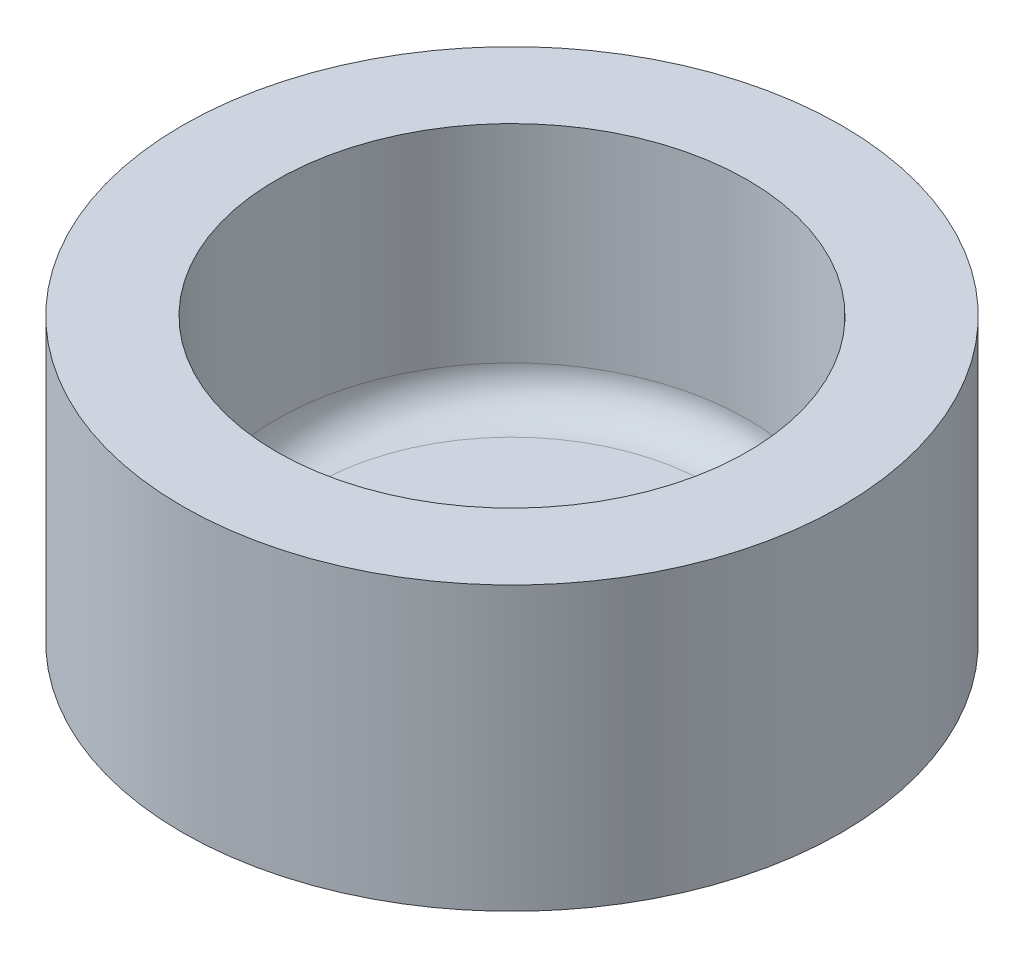
ISO-10303-21;
HEADER;
FILE_DESCRIPTION(('STEP AP214'),'2;1');
FILE_NAME('part.step','',(''),(''),'','','');
FILE_SCHEMA(('AUTOMOTIVE_DESIGN { 1 0 10303 214 1 1 1 1 }'));
ENDSEC;
DATA;
#1=APPLICATION_CONTEXT('core data for automotive mechanical design processes');
#2=APPLICATION_PROTOCOL_DEFINITION('international standard','automotive_design',2000,#1);
#3=PRODUCT_CONTEXT('',#1,'mechanical');
#4=PRODUCT('Part','Part','',(#3));
#5=PRODUCT_RELATED_PRODUCT_CATEGORY('part','',(#4));
#6=PRODUCT_DEFINITION_FORMATION('','',#4);
#7=PRODUCT_DEFINITION_CONTEXT('part definition',#1,'design');
#8=PRODUCT_DEFINITION('design','',#6,#7);
#9=PRODUCT_DEFINITION_SHAPE('','',#8);
#10=(LENGTH_UNIT() NAMED_UNIT(*) SI_UNIT(.MILLI.,.METRE.));
#11=(NAMED_UNIT(*) PLANE_ANGLE_UNIT() SI_UNIT($,.RADIAN.));
#12=(NAMED_UNIT(*) SI_UNIT($,.STERADIAN.) SOLID_ANGLE_UNIT());
#13=UNCERTAINTY_MEASURE_WITH_UNIT(LENGTH_MEASURE(1.E-05),#10,'distance_accuracy_value','');
#14=(GEOMETRIC_REPRESENTATION_CONTEXT(3) GLOBAL_UNCERTAINTY_ASSIGNED_CONTEXT((#13)) GLOBAL_UNIT_ASSIGNED_CONTEXT((#10,
#11,#12)) REPRESENTATION_CONTEXT('',''));
#15=CARTESIAN_POINT('',(0.,0.,0.));
#16=DIRECTION('',(0.,0.,1.));
#17=DIRECTION('',(1.,0.,0.));
#18=AXIS2_PLACEMENT_3D('',#15,#16,#17);
#19=CARTESIAN_POINT('',(0.,15.,0.));
#20=DIRECTION('',(0.,-1.,0.));
#21=DIRECTION('',(0.,0.,-1.));
#22=AXIS2_PLACEMENT_3D('',#19,#20,#21);
#23=CYLINDRICAL_SURFACE('',#22,12.5);
#24=CARTESIAN_POINT('',(0.,4.,0.));
#25=DIRECTION('',(0.,-1.,0.));
#26=DIRECTION('',(0.,0.,-1.));
#27=AXIS2_PLACEMENT_3D('',#24,#25,#26);
#28=CIRCLE('',#27,12.5);
#29=CARTESIAN_POINT('',(0.,4.,-12.5));
#30=VERTEX_POINT('',#29);
#31=EDGE_CURVE('E42',#30,#30,#28,.T.);
#32=ORIENTED_EDGE('',*,*,#31,.T.);
#33=EDGE_LOOP('',(#32));
#34=FACE_BOUND('',#33,.T.);
#35=CARTESIAN_POINT('',(0.,15.,0.));
#36=DIRECTION('',(0.,1.,0.));
#37=DIRECTION('',(0.,0.,1.));
#38=AXIS2_PLACEMENT_3D('',#35,#36,#37);
#39=CIRCLE('',#38,12.5);
#40=CARTESIAN_POINT('',(0.,15.,12.5));
#41=VERTEX_POINT('',#40);
#42=EDGE_CURVE('E54',#41,#41,#39,.T.);
#43=ORIENTED_EDGE('',*,*,#42,.T.);
#44=EDGE_LOOP('',(#43));
#45=FACE_BOUND('',#44,.T.);
#46=ADVANCED_FACE('F35',(#34,#45),#23,.F.);
#47=CARTESIAN_POINT('',(0.,15.,0.));
#48=DIRECTION('',(0.,1.,0.));
#49=DIRECTION('',(0.,0.,1.));
#50=AXIS2_PLACEMENT_3D('',#47,#48,#49);
#51=PLANE('',#50);
#52=CARTESIAN_POINT('',(0.,15.,0.));
#53=DIRECTION('',(0.,1.,0.));
#54=DIRECTION('',(0.,0.,1.));
#55=AXIS2_PLACEMENT_3D('',#52,#53,#54);
#56=CIRCLE('',#55,17.5);
#57=CARTESIAN_POINT('',(0.,15.,17.5));
#58=VERTEX_POINT('',#57);
#59=EDGE_CURVE('E46',#58,#58,#56,.T.);
#60=ORIENTED_EDGE('',*,*,#59,.T.);
#61=EDGE_LOOP('',(#60));
#62=FACE_BOUND('',#61,.T.);
#63=ORIENTED_EDGE('',*,*,#42,.F.);
#64=EDGE_LOOP('',(#63));
#65=FACE_BOUND('',#64,.T.);
#66=ADVANCED_FACE('F60',(#62,#65),#51,.T.);
#67=CARTESIAN_POINT('',(0.,0.,0.));
#68=DIRECTION('',(0.,1.,0.));
#69=DIRECTION('',(0.,0.,1.));
#70=AXIS2_PLACEMENT_3D('',#67,#68,#69);
#71=PLANE('',#70);
#72=CARTESIAN_POINT('',(0.,0.,0.));
#73=DIRECTION('',(0.,1.,0.));
#74=DIRECTION('',(0.,0.,1.));
#75=AXIS2_PLACEMENT_3D('',#72,#73,#74);
#76=CIRCLE('',#75,17.5);
#77=CARTESIAN_POINT('',(0.,0.,17.5));
#78=VERTEX_POINT('',#77);
#79=EDGE_CURVE('E50',#78,#78,#76,.T.);
#80=ORIENTED_EDGE('',*,*,#79,.F.);
#81=EDGE_LOOP('',(#80));
#82=FACE_BOUND('',#81,.T.);
#83=ADVANCED_FACE('F62',(#82),#71,.F.);
#84=CARTESIAN_POINT('',(0.,15.,0.));
#85=DIRECTION('',(0.,-1.,0.));
#86=DIRECTION('',(0.,0.,-1.));
#87=AXIS2_PLACEMENT_3D('',#84,#85,#86);
#88=CYLINDRICAL_SURFACE('',#87,17.5);
#89=ORIENTED_EDGE('',*,*,#59,.F.);
#90=EDGE_LOOP('',(#89));
#91=FACE_BOUND('',#90,.T.);
#92=ORIENTED_EDGE('',*,*,#79,.T.);
#93=EDGE_LOOP('',(#92));
#94=FACE_BOUND('',#93,.T.);
#95=ADVANCED_FACE('F69',(#91,#94),#88,.T.);
#96=CARTESIAN_POINT('',(0.,2.,0.));
#97=DIRECTION('',(0.,-1.,0.));
#98=DIRECTION('',(0.,0.,-1.));
#99=AXIS2_PLACEMENT_3D('',#96,#97,#98);
#100=PLANE('',#99);
#101=CARTESIAN_POINT('',(0.,2.,0.));
#102=DIRECTION('',(0.,-1.,0.));
#103=DIRECTION('',(0.,0.,-1.));
#104=AXIS2_PLACEMENT_3D('',#101,#102,#103);
#105=CIRCLE('',#104,10.5);
#106=CARTESIAN_POINT('',(0.,2.,-10.5));
#107=VERTEX_POINT('',#106);
#108=EDGE_CURVE('E10',#107,#107,#105,.F.);
#109=ORIENTED_EDGE('',*,*,#108,.T.);
#110=EDGE_LOOP('',(#109));
#111=FACE_BOUND('',#110,.T.);
#112=ADVANCED_FACE('F75',(#111),#100,.F.);
#113=CARTESIAN_POINT('',(0.,4.,0.));
#114=DIRECTION('',(0.,-1.,0.));
#115=DIRECTION('',(0.,0.,-1.));
#116=AXIS2_PLACEMENT_3D('',#113,#114,#115);
#117=TOROIDAL_SURFACE('',#116,10.5,2.);
#118=ORIENTED_EDGE('',*,*,#108,.F.);
#119=EDGE_LOOP('',(#118));
#120=FACE_BOUND('',#119,.T.);
#121=ORIENTED_EDGE('',*,*,#31,.F.);
#122=EDGE_LOOP('',(#121));
#123=FACE_BOUND('',#122,.T.);
#124=ADVANCED_FACE('F37',(#120,#123),#117,.F.);
#125=CLOSED_SHELL('',(#46,#66,#83,#95,#112,#124));
#126=MANIFOLD_SOLID_BREP('B2',#125);
#127=ADVANCED_BREP_SHAPE_REPRESENTATION('',(#18,#126),#14);
#128=SHAPE_DEFINITION_REPRESENTATION(#9,#127);
ENDSEC;
END-ISO-10303-21;
